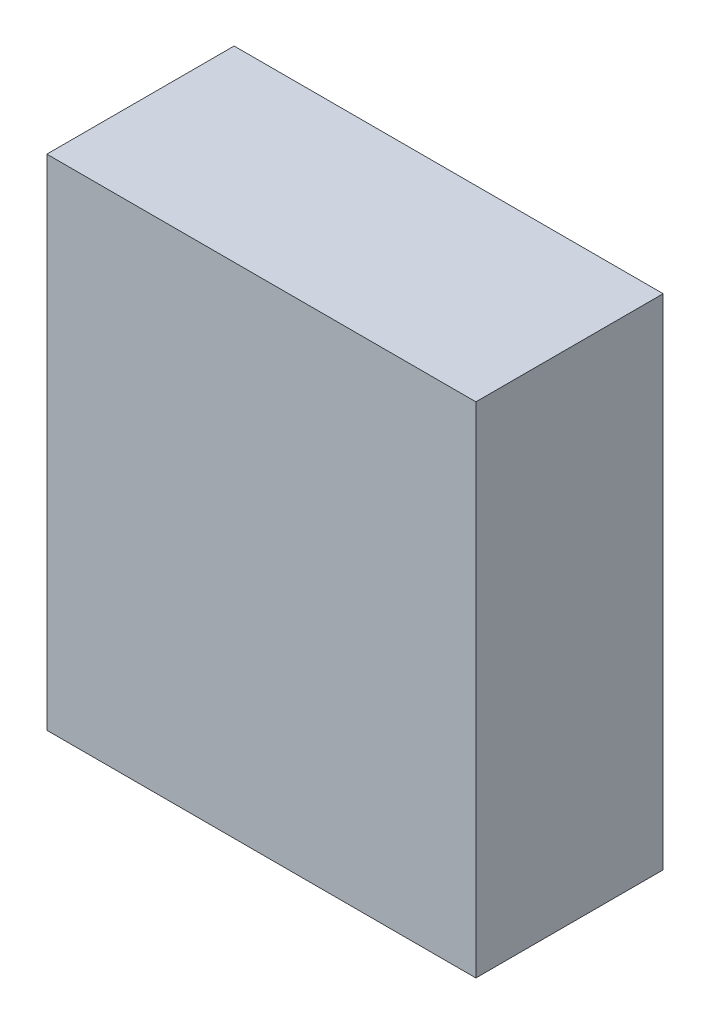
ISO-10303-21;
HEADER;
FILE_DESCRIPTION(('STEP AP214'),'2;1');
FILE_NAME('part.step','',(''),(''),'','','');
FILE_SCHEMA(('AUTOMOTIVE_DESIGN { 1 0 10303 214 1 1 1 1 }'));
ENDSEC;
DATA;
#1=APPLICATION_CONTEXT('core data for automotive mechanical design processes');
#2=APPLICATION_PROTOCOL_DEFINITION('international standard','automotive_design',2000,#1);
#3=PRODUCT_CONTEXT('',#1,'mechanical');
#4=PRODUCT('Part','Part','',(#3));
#5=PRODUCT_RELATED_PRODUCT_CATEGORY('part','',(#4));
#6=PRODUCT_DEFINITION_FORMATION('','',#4);
#7=PRODUCT_DEFINITION_CONTEXT('part definition',#1,'design');
#8=PRODUCT_DEFINITION('design','',#6,#7);
#9=PRODUCT_DEFINITION_SHAPE('','',#8);
#10=(LENGTH_UNIT() NAMED_UNIT(*) SI_UNIT(.MILLI.,.METRE.));
#11=(NAMED_UNIT(*) PLANE_ANGLE_UNIT() SI_UNIT($,.RADIAN.));
#12=(NAMED_UNIT(*) SI_UNIT($,.STERADIAN.) SOLID_ANGLE_UNIT());
#13=UNCERTAINTY_MEASURE_WITH_UNIT(LENGTH_MEASURE(1.E-05),#10,'distance_accuracy_value','');
#14=(GEOMETRIC_REPRESENTATION_CONTEXT(3) GLOBAL_UNCERTAINTY_ASSIGNED_CONTEXT((#13)) GLOBAL_UNIT_ASSIGNED_CONTEXT((#10,
#11,#12)) REPRESENTATION_CONTEXT('',''));
#15=CARTESIAN_POINT('',(0.,0.,0.));
#16=DIRECTION('',(0.,0.,1.));
#17=DIRECTION('',(1.,0.,0.));
#18=AXIS2_PLACEMENT_3D('',#15,#16,#17);
#19=CARTESIAN_POINT('',(-20.2638691958869,-13.3225490196078,10.));
#20=DIRECTION('',(-1.,0.,0.));
#21=DIRECTION('',(0.,0.,1.));
#22=AXIS2_PLACEMENT_3D('',#19,#20,#21);
#23=PLANE('',#22);
#24=DIRECTION('',(0.,1.,0.));
#25=VECTOR('',#24,1.);
#26=CARTESIAN_POINT('',(-20.2638691958869,-13.3225490196078,0.));
#27=LINE('',#26,#25);
#28=CARTESIAN_POINT('',(-20.2638691958869,-13.3225490196078,0.));
#29=VERTEX_POINT('',#28);
#30=CARTESIAN_POINT('',(-20.2638691958869,13.3225490196078,0.));
#31=VERTEX_POINT('',#30);
#32=EDGE_CURVE('E95',#29,#31,#27,.T.);
#33=ORIENTED_EDGE('',*,*,#32,.T.);
#34=DIRECTION('',(0.,0.,-1.));
#35=VECTOR('',#34,1.);
#36=CARTESIAN_POINT('',(-20.2638691958869,13.3225490196078,10.));
#37=LINE('',#36,#35);
#38=CARTESIAN_POINT('',(-20.2638691958869,13.3225490196078,10.));
#39=VERTEX_POINT('',#38);
#40=EDGE_CURVE('E11',#39,#31,#37,.T.);
#41=ORIENTED_EDGE('',*,*,#40,.F.);
#42=DIRECTION('',(0.,1.,0.));
#43=VECTOR('',#42,1.);
#44=CARTESIAN_POINT('',(-20.2638691958869,-13.3225490196078,10.));
#45=LINE('',#44,#43);
#46=CARTESIAN_POINT('',(-20.2638691958869,-13.3225490196078,10.));
#47=VERTEX_POINT('',#46);
#48=EDGE_CURVE('E83',#47,#39,#45,.T.);
#49=ORIENTED_EDGE('',*,*,#48,.F.);
#50=DIRECTION('',(0.,0.,-1.));
#51=VECTOR('',#50,1.);
#52=CARTESIAN_POINT('',(-20.2638691958869,-13.3225490196078,10.));
#53=LINE('',#52,#51);
#54=EDGE_CURVE('E91',#47,#29,#53,.T.);
#55=ORIENTED_EDGE('',*,*,#54,.T.);
#56=EDGE_LOOP('',(#33,#41,#49,#55));
#57=FACE_BOUND('',#56,.T.);
#58=ADVANCED_FACE('F32',(#57),#23,.F.);
#59=CARTESIAN_POINT('',(-43.1736731174555,13.3225490196078,10.));
#60=DIRECTION('',(0.,-1.,0.));
#61=DIRECTION('',(0.,0.,-1.));
#62=AXIS2_PLACEMENT_3D('',#59,#60,#61);
#63=PLANE('',#62);
#64=DIRECTION('',(-1.,0.,0.));
#65=VECTOR('',#64,1.);
#66=CARTESIAN_POINT('',(-43.1736731174555,13.3225490196078,0.));
#67=LINE('',#66,#65);
#68=CARTESIAN_POINT('',(-43.1736731174555,13.3225490196078,0.));
#69=VERTEX_POINT('',#68);
#70=EDGE_CURVE('E87',#31,#69,#67,.T.);
#71=ORIENTED_EDGE('',*,*,#70,.T.);
#72=DIRECTION('',(0.,0.,-1.));
#73=VECTOR('',#72,1.);
#74=CARTESIAN_POINT('',(-43.1736731174555,13.3225490196078,10.));
#75=LINE('',#74,#73);
#76=CARTESIAN_POINT('',(-43.1736731174555,13.3225490196078,10.));
#77=VERTEX_POINT('',#76);
#78=EDGE_CURVE('E40',#77,#69,#75,.T.);
#79=ORIENTED_EDGE('',*,*,#78,.F.);
#80=DIRECTION('',(-1.,0.,0.));
#81=VECTOR('',#80,1.);
#82=CARTESIAN_POINT('',(-43.1736731174555,13.3225490196078,10.));
#83=LINE('',#82,#81);
#84=EDGE_CURVE('E78',#39,#77,#83,.T.);
#85=ORIENTED_EDGE('',*,*,#84,.F.);
#86=ORIENTED_EDGE('',*,*,#40,.T.);
#87=EDGE_LOOP('',(#71,#79,#85,#86));
#88=FACE_BOUND('',#87,.T.);
#89=ADVANCED_FACE('F86',(#88),#63,.F.);
#90=CARTESIAN_POINT('',(-43.1736731174555,-13.3225490196078,10.));
#91=DIRECTION('',(1.,0.,0.));
#92=DIRECTION('',(0.,0.,-1.));
#93=AXIS2_PLACEMENT_3D('',#90,#91,#92);
#94=PLANE('',#93);
#95=DIRECTION('',(0.,-1.,0.));
#96=VECTOR('',#95,1.);
#97=CARTESIAN_POINT('',(-43.1736731174555,-13.3225490196078,0.));
#98=LINE('',#97,#96);
#99=CARTESIAN_POINT('',(-43.1736731174555,-13.3225490196078,0.));
#100=VERTEX_POINT('',#99);
#101=EDGE_CURVE('E65',#69,#100,#98,.T.);
#102=ORIENTED_EDGE('',*,*,#101,.T.);
#103=DIRECTION('',(0.,0.,-1.));
#104=VECTOR('',#103,1.);
#105=CARTESIAN_POINT('',(-43.1736731174555,-13.3225490196078,10.));
#106=LINE('',#105,#104);
#107=CARTESIAN_POINT('',(-43.1736731174555,-13.3225490196078,10.));
#108=VERTEX_POINT('',#107);
#109=EDGE_CURVE('E88',#108,#100,#106,.T.);
#110=ORIENTED_EDGE('',*,*,#109,.F.);
#111=DIRECTION('',(0.,-1.,0.));
#112=VECTOR('',#111,1.);
#113=CARTESIAN_POINT('',(-43.1736731174555,-13.3225490196078,10.));
#114=LINE('',#113,#112);
#115=EDGE_CURVE('E81',#77,#108,#114,.T.);
#116=ORIENTED_EDGE('',*,*,#115,.F.);
#117=ORIENTED_EDGE('',*,*,#78,.T.);
#118=EDGE_LOOP('',(#102,#110,#116,#117));
#119=FACE_BOUND('',#118,.T.);
#120=ADVANCED_FACE('F89',(#119),#94,.F.);
#121=CARTESIAN_POINT('',(-43.1736731174555,-13.3225490196078,10.));
#122=DIRECTION('',(0.,1.,0.));
#123=DIRECTION('',(0.,0.,1.));
#124=AXIS2_PLACEMENT_3D('',#121,#122,#123);
#125=PLANE('',#124);
#126=DIRECTION('',(1.,0.,0.));
#127=VECTOR('',#126,1.);
#128=CARTESIAN_POINT('',(-43.1736731174555,-13.3225490196078,0.));
#129=LINE('',#128,#127);
#130=EDGE_CURVE('E71',#100,#29,#129,.T.);
#131=ORIENTED_EDGE('',*,*,#130,.T.);
#132=ORIENTED_EDGE('',*,*,#54,.F.);
#133=DIRECTION('',(1.,0.,0.));
#134=VECTOR('',#133,1.);
#135=CARTESIAN_POINT('',(-43.1736731174555,-13.3225490196078,10.));
#136=LINE('',#135,#134);
#137=EDGE_CURVE('E48',#108,#47,#136,.T.);
#138=ORIENTED_EDGE('',*,*,#137,.F.);
#139=ORIENTED_EDGE('',*,*,#109,.T.);
#140=EDGE_LOOP('',(#131,#132,#138,#139));
#141=FACE_BOUND('',#140,.T.);
#142=ADVANCED_FACE('F102',(#141),#125,.F.);
#143=CARTESIAN_POINT('',(0.,0.,10.));
#144=DIRECTION('',(0.,0.,-1.));
#145=DIRECTION('',(-1.,0.,0.));
#146=AXIS2_PLACEMENT_3D('',#143,#144,#145);
#147=PLANE('',#146);
#148=ORIENTED_EDGE('',*,*,#48,.T.);
#149=ORIENTED_EDGE('',*,*,#84,.T.);
#150=ORIENTED_EDGE('',*,*,#115,.T.);
#151=ORIENTED_EDGE('',*,*,#137,.T.);
#152=EDGE_LOOP('',(#148,#149,#150,#151));
#153=FACE_BOUND('',#152,.T.);
#154=ADVANCED_FACE('F79',(#153),#147,.F.);
#155=CARTESIAN_POINT('',(0.,0.,0.));
#156=DIRECTION('',(0.,0.,-1.));
#157=DIRECTION('',(-1.,0.,0.));
#158=AXIS2_PLACEMENT_3D('',#155,#156,#157);
#159=PLANE('',#158);
#160=ORIENTED_EDGE('',*,*,#32,.F.);
#161=ORIENTED_EDGE('',*,*,#130,.F.);
#162=ORIENTED_EDGE('',*,*,#101,.F.);
#163=ORIENTED_EDGE('',*,*,#70,.F.);
#164=EDGE_LOOP('',(#160,#161,#162,#163));
#165=FACE_BOUND('',#164,.T.);
#166=ADVANCED_FACE('F105',(#165),#159,.T.);
#167=CLOSED_SHELL('',(#58,#89,#120,#142,#154,#166));
#168=MANIFOLD_SOLID_BREP('B2',#167);
#169=ADVANCED_BREP_SHAPE_REPRESENTATION('',(#18,#168),#14);
#170=SHAPE_DEFINITION_REPRESENTATION(#9,#169);
ENDSEC;
END-ISO-10303-21;
